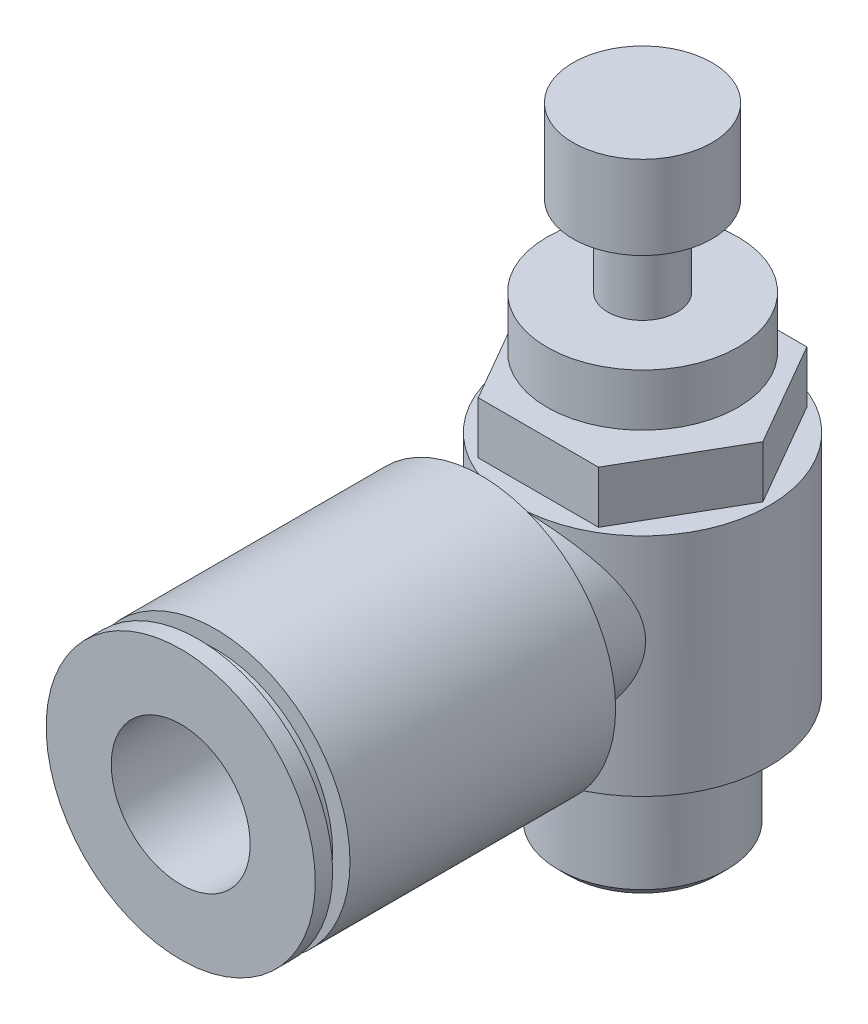
ISO-10303-21;
HEADER;
FILE_DESCRIPTION(('STEP AP214'),'2;1');
FILE_NAME('part.step','',(''),(''),'','','');
FILE_SCHEMA(('AUTOMOTIVE_DESIGN { 1 0 10303 214 1 1 1 1 }'));
ENDSEC;
DATA;
#1=APPLICATION_CONTEXT('core data for automotive mechanical design processes');
#2=APPLICATION_PROTOCOL_DEFINITION('international standard','automotive_design',2000,#1);
#3=PRODUCT_CONTEXT('',#1,'mechanical');
#4=PRODUCT('Part','Part','',(#3));
#5=PRODUCT_RELATED_PRODUCT_CATEGORY('part','',(#4));
#6=PRODUCT_DEFINITION_FORMATION('','',#4);
#7=PRODUCT_DEFINITION_CONTEXT('part definition',#1,'design');
#8=PRODUCT_DEFINITION('design','',#6,#7);
#9=PRODUCT_DEFINITION_SHAPE('','',#8);
#10=(LENGTH_UNIT() NAMED_UNIT(*) SI_UNIT(.MILLI.,.METRE.));
#11=(NAMED_UNIT(*) PLANE_ANGLE_UNIT() SI_UNIT($,.RADIAN.));
#12=(NAMED_UNIT(*) SI_UNIT($,.STERADIAN.) SOLID_ANGLE_UNIT());
#13=UNCERTAINTY_MEASURE_WITH_UNIT(LENGTH_MEASURE(1.E-05),#10,'distance_accuracy_value','');
#14=(GEOMETRIC_REPRESENTATION_CONTEXT(3) GLOBAL_UNCERTAINTY_ASSIGNED_CONTEXT((#13)) GLOBAL_UNIT_ASSIGNED_CONTEXT((#10,
#11,#12)) REPRESENTATION_CONTEXT('',''));
#15=CARTESIAN_POINT('',(0.,0.,0.));
#16=DIRECTION('',(0.,0.,1.));
#17=DIRECTION('',(1.,0.,0.));
#18=AXIS2_PLACEMENT_3D('',#15,#16,#17);
#19=CARTESIAN_POINT('',(4.04800210819405,21.7,4.));
#20=DIRECTION('',(0.,1.,0.));
#21=DIRECTION('',(0.,0.,-1.));
#22=AXIS2_PLACEMENT_3D('',#19,#20,#21);
#23=PLANE('',#22);
#24=CARTESIAN_POINT('',(0.,21.7,0.));
#25=DIRECTION('',(0.,-1.,0.));
#26=DIRECTION('',(0.,0.,-1.));
#27=AXIS2_PLACEMENT_3D('',#24,#25,#26);
#28=CIRCLE('',#27,4.);
#29=CARTESIAN_POINT('',(0.,21.7,-4.));
#30=VERTEX_POINT('',#29);
#31=EDGE_CURVE('E19',#30,#30,#28,.T.);
#32=ORIENTED_EDGE('',*,*,#31,.F.);
#33=EDGE_LOOP('',(#32));
#34=FACE_BOUND('',#33,.T.);
#35=ADVANCED_FACE('F16',(#34),#23,.T.);
#36=CARTESIAN_POINT('',(0.,16.9,0.));
#37=DIRECTION('',(0.,-1.,0.));
#38=DIRECTION('',(0.,0.,-1.));
#39=AXIS2_PLACEMENT_3D('',#36,#37,#38);
#40=CYLINDRICAL_SURFACE('',#39,4.);
#41=CARTESIAN_POINT('',(0.,16.9,0.));
#42=DIRECTION('',(0.,-1.,0.));
#43=DIRECTION('',(0.,0.,-1.));
#44=AXIS2_PLACEMENT_3D('',#41,#42,#43);
#45=CIRCLE('',#44,4.);
#46=CARTESIAN_POINT('',(0.,16.9,-4.));
#47=VERTEX_POINT('',#46);
#48=EDGE_CURVE('E210',#47,#47,#45,.T.);
#49=ORIENTED_EDGE('',*,*,#48,.F.);
#50=EDGE_LOOP('',(#49));
#51=FACE_BOUND('',#50,.T.);
#52=ORIENTED_EDGE('',*,*,#31,.T.);
#53=EDGE_LOOP('',(#52));
#54=FACE_BOUND('',#53,.T.);
#55=ADVANCED_FACE('F116',(#51,#54),#40,.T.);
#56=CARTESIAN_POINT('',(-4.08,-4.,8.1));
#57=CARTESIAN_POINT('',(-4.,-4.,8.1));
#58=CARTESIAN_POINT('',(4.,-4.,8.1));
#59=CARTESIAN_POINT('',(4.0808,-4.,8.1));
#60=B_SPLINE_CURVE_WITH_KNOTS('',1,(#56,#57,#58,#59),.UNSPECIFIED.,.F.,.F.,(2,1,1,2),(-0.01,0.,
1.,1.0101),.UNSPECIFIED.);
#61=DIRECTION('',(0.,1.,0.));
#62=VECTOR('',#61,1.);
#63=SURFACE_OF_LINEAR_EXTRUSION('',#60,#62);
#64=CARTESIAN_POINT('',(0.,0.,8.1));
#65=DIRECTION('',(0.,0.,-1.));
#66=DIRECTION('',(-1.,0.,0.));
#67=AXIS2_PLACEMENT_3D('',#64,#65,#66);
#68=CIRCLE('',#67,4.);
#69=CARTESIAN_POINT('',(-4.00000000000001,0.,8.1));
#70=VERTEX_POINT('',#69);
#71=EDGE_CURVE('E208',#70,#70,#68,.T.);
#72=ORIENTED_EDGE('',*,*,#71,.F.);
#73=EDGE_LOOP('',(#72));
#74=FACE_BOUND('',#73,.T.);
#75=ADVANCED_FACE('F112',(#74),#63,.T.);
#76=CARTESIAN_POINT('',(4.04800210819405,16.9,-4.));
#77=DIRECTION('',(0.,-1.,0.));
#78=DIRECTION('',(0.,0.,1.));
#79=AXIS2_PLACEMENT_3D('',#76,#77,#78);
#80=PLANE('',#79);
#81=CARTESIAN_POINT('',(0.,16.9,0.));
#82=DIRECTION('',(0.,-1.,0.));
#83=DIRECTION('',(1.,0.,0.));
#84=AXIS2_PLACEMENT_3D('',#81,#82,#83);
#85=CIRCLE('',#84,2.);
#86=CARTESIAN_POINT('',(2.,16.9,0.));
#87=VERTEX_POINT('',#86);
#88=EDGE_CURVE('E205',#87,#87,#85,.T.);
#89=ORIENTED_EDGE('',*,*,#88,.F.);
#90=EDGE_LOOP('',(#89));
#91=FACE_BOUND('',#90,.T.);
#92=ORIENTED_EDGE('',*,*,#48,.T.);
#93=EDGE_LOOP('',(#92));
#94=FACE_BOUND('',#93,.T.);
#95=ADVANCED_FACE('F115',(#91,#94),#80,.T.);
#96=CARTESIAN_POINT('',(0.,0.,26.6));
#97=DIRECTION('',(0.,0.,-1.));
#98=DIRECTION('',(-1.,0.,0.));
#99=AXIS2_PLACEMENT_3D('',#96,#97,#98);
#100=CYLINDRICAL_SURFACE('',#99,4.);
#101=CARTESIAN_POINT('',(0.,0.,26.6));
#102=DIRECTION('',(0.,0.,-1.));
#103=DIRECTION('',(-1.,0.,0.));
#104=AXIS2_PLACEMENT_3D('',#101,#102,#103);
#105=CIRCLE('',#104,4.);
#106=CARTESIAN_POINT('',(-4.,0.,26.6));
#107=VERTEX_POINT('',#106);
#108=EDGE_CURVE('E202',#107,#107,#105,.T.);
#109=ORIENTED_EDGE('',*,*,#108,.F.);
#110=EDGE_LOOP('',(#109));
#111=FACE_BOUND('',#110,.T.);
#112=ORIENTED_EDGE('',*,*,#71,.T.);
#113=EDGE_LOOP('',(#112));
#114=FACE_BOUND('',#113,.T.);
#115=ADVANCED_FACE('F216',(#111,#114),#100,.F.);
#116=CARTESIAN_POINT('',(0.,12.25,0.));
#117=DIRECTION('',(0.,-1.,0.));
#118=DIRECTION('',(1.,0.,0.));
#119=AXIS2_PLACEMENT_3D('',#116,#117,#118);
#120=CYLINDRICAL_SURFACE('',#119,2.);
#121=CARTESIAN_POINT('',(0.,12.25,0.));
#122=DIRECTION('',(0.,-1.,0.));
#123=DIRECTION('',(1.,0.,0.));
#124=AXIS2_PLACEMENT_3D('',#121,#122,#123);
#125=CIRCLE('',#124,2.);
#126=CARTESIAN_POINT('',(2.,12.25,0.));
#127=VERTEX_POINT('',#126);
#128=EDGE_CURVE('E199',#127,#127,#125,.T.);
#129=ORIENTED_EDGE('',*,*,#128,.F.);
#130=EDGE_LOOP('',(#129));
#131=FACE_BOUND('',#130,.T.);
#132=ORIENTED_EDGE('',*,*,#88,.T.);
#133=EDGE_LOOP('',(#132));
#134=FACE_BOUND('',#133,.T.);
#135=ADVANCED_FACE('F221',(#131,#134),#120,.T.);
#136=CARTESIAN_POINT('',(7.84300210826893,-7.75,26.6));
#137=DIRECTION('',(0.,0.,1.));
#138=DIRECTION('',(0.,1.,0.));
#139=AXIS2_PLACEMENT_3D('',#136,#137,#138);
#140=PLANE('',#139);
#141=ORIENTED_EDGE('',*,*,#108,.T.);
#142=EDGE_LOOP('',(#141));
#143=FACE_BOUND('',#142,.T.);
#144=CARTESIAN_POINT('',(0.,0.,26.6));
#145=DIRECTION('',(0.,0.,1.));
#146=DIRECTION('',(1.,0.,0.));
#147=AXIS2_PLACEMENT_3D('',#144,#145,#146);
#148=CIRCLE('',#147,7.75);
#149=CARTESIAN_POINT('',(7.75,0.,26.6));
#150=VERTEX_POINT('',#149);
#151=EDGE_CURVE('E196',#150,#150,#148,.F.);
#152=ORIENTED_EDGE('',*,*,#151,.F.);
#153=EDGE_LOOP('',(#152));
#154=FACE_BOUND('',#153,.T.);
#155=ADVANCED_FACE('F226',(#143,#154),#140,.T.);
#156=CARTESIAN_POINT('',(5.56600210823252,12.25,5.5));
#157=DIRECTION('',(0.,1.,0.));
#158=DIRECTION('',(0.,0.,-1.));
#159=AXIS2_PLACEMENT_3D('',#156,#157,#158);
#160=PLANE('',#159);
#161=ORIENTED_EDGE('',*,*,#128,.T.);
#162=EDGE_LOOP('',(#161));
#163=FACE_BOUND('',#162,.T.);
#164=CARTESIAN_POINT('',(0.,12.25,0.));
#165=DIRECTION('',(0.,-1.,0.));
#166=DIRECTION('',(1.,0.,0.));
#167=AXIS2_PLACEMENT_3D('',#164,#165,#166);
#168=CIRCLE('',#167,5.5);
#169=CARTESIAN_POINT('',(5.5,12.25,0.));
#170=VERTEX_POINT('',#169);
#171=EDGE_CURVE('E193',#170,#170,#168,.T.);
#172=ORIENTED_EDGE('',*,*,#171,.F.);
#173=EDGE_LOOP('',(#172));
#174=FACE_BOUND('',#173,.T.);
#175=ADVANCED_FACE('F232',(#163,#174),#160,.T.);
#176=CARTESIAN_POINT('',(0.,0.,26.6));
#177=DIRECTION('',(0.,0.,1.));
#178=DIRECTION('',(1.,0.,0.));
#179=AXIS2_PLACEMENT_3D('',#176,#177,#178);
#180=CYLINDRICAL_SURFACE('',#179,7.75);
#181=ORIENTED_EDGE('',*,*,#151,.T.);
#182=EDGE_LOOP('',(#181));
#183=FACE_BOUND('',#182,.T.);
#184=CARTESIAN_POINT('',(0.,0.,25.6));
#185=DIRECTION('',(0.,0.,1.));
#186=DIRECTION('',(1.,0.,0.));
#187=AXIS2_PLACEMENT_3D('',#184,#185,#186);
#188=CIRCLE('',#187,7.75);
#189=CARTESIAN_POINT('',(7.75,0.,25.6));
#190=VERTEX_POINT('',#189);
#191=EDGE_CURVE('E190',#190,#190,#188,.F.);
#192=ORIENTED_EDGE('',*,*,#191,.F.);
#193=EDGE_LOOP('',(#192));
#194=FACE_BOUND('',#193,.T.);
#195=ADVANCED_FACE('F239',(#183,#194),#180,.T.);
#196=CARTESIAN_POINT('',(0.,9.25,0.));
#197=DIRECTION('',(0.,-1.,0.));
#198=DIRECTION('',(1.,0.,0.));
#199=AXIS2_PLACEMENT_3D('',#196,#197,#198);
#200=CYLINDRICAL_SURFACE('',#199,5.5);
#201=CARTESIAN_POINT('',(0.,9.25,0.));
#202=DIRECTION('',(0.,-1.,0.));
#203=DIRECTION('',(1.,0.,0.));
#204=AXIS2_PLACEMENT_3D('',#201,#202,#203);
#205=CIRCLE('',#204,5.5);
#206=CARTESIAN_POINT('',(5.5,9.25,0.));
#207=VERTEX_POINT('',#206);
#208=EDGE_CURVE('E187',#207,#207,#205,.T.);
#209=ORIENTED_EDGE('',*,*,#208,.F.);
#210=EDGE_LOOP('',(#209));
#211=FACE_BOUND('',#210,.T.);
#212=ORIENTED_EDGE('',*,*,#171,.T.);
#213=EDGE_LOOP('',(#212));
#214=FACE_BOUND('',#213,.T.);
#215=ADVANCED_FACE('F243',(#211,#214),#200,.T.);
#216=CARTESIAN_POINT('',(7.84300210826894,7.75,25.6));
#217=DIRECTION('',(0.,0.,-1.));
#218=DIRECTION('',(0.,-1.,0.));
#219=AXIS2_PLACEMENT_3D('',#216,#217,#218);
#220=PLANE('',#219);
#221=CARTESIAN_POINT('',(0.,0.,25.6));
#222=DIRECTION('',(0.,0.,1.));
#223=DIRECTION('',(1.,0.,0.));
#224=AXIS2_PLACEMENT_3D('',#221,#222,#223);
#225=CIRCLE('',#224,6.75);
#226=CARTESIAN_POINT('',(6.75,0.,25.6));
#227=VERTEX_POINT('',#226);
#228=EDGE_CURVE('E184',#227,#227,#225,.F.);
#229=ORIENTED_EDGE('',*,*,#228,.F.);
#230=EDGE_LOOP('',(#229));
#231=FACE_BOUND('',#230,.T.);
#232=ORIENTED_EDGE('',*,*,#191,.T.);
#233=EDGE_LOOP('',(#232));
#234=FACE_BOUND('',#233,.T.);
#235=ADVANCED_FACE('F247',(#231,#234),#220,.T.);
#236=CARTESIAN_POINT('',(5.56600210823252,9.25,-5.5));
#237=DIRECTION('',(0.,-1.,0.));
#238=DIRECTION('',(0.,0.,1.));
#239=AXIS2_PLACEMENT_3D('',#236,#237,#238);
#240=PLANE('',#239);
#241=CARTESIAN_POINT('',(0.,9.25,0.));
#242=DIRECTION('',(0.,-1.,0.));
#243=DIRECTION('',(0.,0.,-1.));
#244=AXIS2_PLACEMENT_3D('',#241,#242,#243);
#245=CIRCLE('',#244,4.);
#246=CARTESIAN_POINT('',(0.,9.25,-4.));
#247=VERTEX_POINT('',#246);
#248=EDGE_CURVE('E181',#247,#247,#245,.T.);
#249=ORIENTED_EDGE('',*,*,#248,.F.);
#250=EDGE_LOOP('',(#249));
#251=FACE_BOUND('',#250,.T.);
#252=ORIENTED_EDGE('',*,*,#208,.T.);
#253=EDGE_LOOP('',(#252));
#254=FACE_BOUND('',#253,.T.);
#255=ADVANCED_FACE('F251',(#251,#254),#240,.T.);
#256=CARTESIAN_POINT('',(0.,0.,25.6));
#257=DIRECTION('',(0.,0.,1.));
#258=DIRECTION('',(1.,0.,0.));
#259=AXIS2_PLACEMENT_3D('',#256,#257,#258);
#260=CYLINDRICAL_SURFACE('',#259,6.75);
#261=ORIENTED_EDGE('',*,*,#228,.T.);
#262=EDGE_LOOP('',(#261));
#263=FACE_BOUND('',#262,.T.);
#264=CARTESIAN_POINT('',(0.,0.,24.6));
#265=DIRECTION('',(0.,0.,1.));
#266=DIRECTION('',(1.,0.,0.));
#267=AXIS2_PLACEMENT_3D('',#264,#265,#266);
#268=CIRCLE('',#267,6.75);
#269=CARTESIAN_POINT('',(6.75,0.,24.6));
#270=VERTEX_POINT('',#269);
#271=EDGE_CURVE('E178',#270,#270,#268,.F.);
#272=ORIENTED_EDGE('',*,*,#271,.F.);
#273=EDGE_LOOP('',(#272));
#274=FACE_BOUND('',#273,.T.);
#275=ADVANCED_FACE('F255',(#263,#274),#260,.T.);
#276=CARTESIAN_POINT('',(0.,8.25,0.));
#277=DIRECTION('',(0.,-1.,0.));
#278=DIRECTION('',(0.,0.,-1.));
#279=AXIS2_PLACEMENT_3D('',#276,#277,#278);
#280=CYLINDRICAL_SURFACE('',#279,4.);
#281=CARTESIAN_POINT('',(0.,8.25,0.));
#282=DIRECTION('',(0.,-1.,0.));
#283=DIRECTION('',(0.,0.,-1.));
#284=AXIS2_PLACEMENT_3D('',#281,#282,#283);
#285=CIRCLE('',#284,4.);
#286=CARTESIAN_POINT('',(0.,8.25,-4.));
#287=VERTEX_POINT('',#286);
#288=EDGE_CURVE('E175',#287,#287,#285,.T.);
#289=ORIENTED_EDGE('',*,*,#288,.F.);
#290=EDGE_LOOP('',(#289));
#291=FACE_BOUND('',#290,.T.);
#292=ORIENTED_EDGE('',*,*,#248,.T.);
#293=EDGE_LOOP('',(#292));
#294=FACE_BOUND('',#293,.T.);
#295=ADVANCED_FACE('F259',(#291,#294),#280,.T.);
#296=CARTESIAN_POINT('',(7.84300210826893,-7.75,24.6));
#297=DIRECTION('',(0.,0.,1.));
#298=DIRECTION('',(0.,1.,0.));
#299=AXIS2_PLACEMENT_3D('',#296,#297,#298);
#300=PLANE('',#299);
#301=ORIENTED_EDGE('',*,*,#271,.T.);
#302=EDGE_LOOP('',(#301));
#303=FACE_BOUND('',#302,.T.);
#304=CARTESIAN_POINT('',(0.,0.,24.6));
#305=DIRECTION('',(0.,0.,1.));
#306=DIRECTION('',(1.,0.,0.));
#307=AXIS2_PLACEMENT_3D('',#304,#305,#306);
#308=CIRCLE('',#307,7.75);
#309=CARTESIAN_POINT('',(7.75,0.,24.6));
#310=VERTEX_POINT('',#309);
#311=EDGE_CURVE('E93',#310,#310,#308,.F.);
#312=ORIENTED_EDGE('',*,*,#311,.F.);
#313=EDGE_LOOP('',(#312));
#314=FACE_BOUND('',#313,.T.);
#315=ADVANCED_FACE('F263',(#303,#314),#300,.T.);
#316=CARTESIAN_POINT('',(-7.01134166903882,8.25,-6.));
#317=DIRECTION('',(0.,1.,0.));
#318=DIRECTION('',(0.,0.,1.));
#319=AXIS2_PLACEMENT_3D('',#316,#317,#318);
#320=PLANE('',#319);
#321=ORIENTED_EDGE('',*,*,#288,.T.);
#322=EDGE_LOOP('',(#321));
#323=FACE_BOUND('',#322,.T.);
#324=DIRECTION('',(-1.,0.,0.));
#325=VECTOR('',#324,1.);
#326=CARTESIAN_POINT('',(0.,8.25,6.));
#327=LINE('',#326,#325);
#328=CARTESIAN_POINT('',(3.46410161513775,8.25,6.));
#329=VERTEX_POINT('',#328);
#330=CARTESIAN_POINT('',(-3.46410161513775,8.25,6.));
#331=VERTEX_POINT('',#330);
#332=EDGE_CURVE('E81',#329,#331,#327,.T.);
#333=ORIENTED_EDGE('',*,*,#332,.F.);
#334=DIRECTION('',(-0.5,0.,0.866025403784438));
#335=VECTOR('',#334,1.);
#336=CARTESIAN_POINT('',(5.19615242270663,8.25,3.));
#337=LINE('',#336,#335);
#338=CARTESIAN_POINT('',(6.92820310527251,8.25,-2.16511547189088E-07));
#339=VERTEX_POINT('',#338);
#340=EDGE_CURVE('E75',#339,#329,#337,.T.);
#341=ORIENTED_EDGE('',*,*,#340,.F.);
#342=DIRECTION('',(0.5,0.,0.866025403784438));
#343=VECTOR('',#342,1.);
#344=CARTESIAN_POINT('',(5.19615242270663,8.25,-3.));
#345=LINE('',#344,#343);
#346=CARTESIAN_POINT('',(3.46410161513775,8.25,-6.));
#347=VERTEX_POINT('',#346);
#348=EDGE_CURVE('E78',#347,#339,#345,.T.);
#349=ORIENTED_EDGE('',*,*,#348,.F.);
#350=DIRECTION('',(1.,0.,0.));
#351=VECTOR('',#350,1.);
#352=CARTESIAN_POINT('',(0.,8.25,-6.));
#353=LINE('',#352,#351);
#354=CARTESIAN_POINT('',(-3.46410161513775,8.25,-6.));
#355=VERTEX_POINT('',#354);
#356=EDGE_CURVE('E352',#355,#347,#353,.T.);
#357=ORIENTED_EDGE('',*,*,#356,.F.);
#358=DIRECTION('',(0.5,0.,-0.866025403784438));
#359=VECTOR('',#358,1.);
#360=CARTESIAN_POINT('',(-5.19615242270663,8.25,-3.));
#361=LINE('',#360,#359);
#362=CARTESIAN_POINT('',(-6.92820310527251,8.25,-2.16511547405929E-07));
#363=VERTEX_POINT('',#362);
#364=EDGE_CURVE('E357',#363,#355,#361,.T.);
#365=ORIENTED_EDGE('',*,*,#364,.F.);
#366=DIRECTION('',(-0.5,0.,-0.866025403784438));
#367=VECTOR('',#366,1.);
#368=CARTESIAN_POINT('',(-5.19615242270663,8.25,3.));
#369=LINE('',#368,#367);
#370=EDGE_CURVE('E362',#331,#363,#369,.T.);
#371=ORIENTED_EDGE('',*,*,#370,.F.);
#372=EDGE_LOOP('',(#333,#341,#349,#357,#365,#371));
#373=FACE_BOUND('',#372,.T.);
#374=ADVANCED_FACE('F77',(#323,#373),#320,.T.);
#375=CARTESIAN_POINT('',(0.,0.,24.6));
#376=DIRECTION('',(0.,0.,1.));
#377=DIRECTION('',(1.,0.,0.));
#378=AXIS2_PLACEMENT_3D('',#375,#376,#377);
#379=CYLINDRICAL_SURFACE('',#378,7.75);
#380=ORIENTED_EDGE('',*,*,#311,.T.);
#381=EDGE_LOOP('',(#380));
#382=FACE_BOUND('',#381,.T.);
#383=CARTESIAN_POINT('',(0.,0.,9.3));
#384=DIRECTION('',(0.,0.,1.));
#385=DIRECTION('',(1.,0.,0.));
#386=AXIS2_PLACEMENT_3D('',#383,#384,#385);
#387=CIRCLE('',#386,7.75);
#388=CARTESIAN_POINT('',(7.75,0.,9.3));
#389=VERTEX_POINT('',#388);
#390=EDGE_CURVE('E169',#389,#389,#387,.F.);
#391=ORIENTED_EDGE('',*,*,#390,.F.);
#392=EDGE_LOOP('',(#391));
#393=FACE_BOUND('',#392,.T.);
#394=ADVANCED_FACE('F270',(#382,#393),#379,.T.);
#395=CARTESIAN_POINT('',(6.92820323027551,5.25,0.));
#396=DIRECTION('',(0.866025403784438,0.,-0.5));
#397=DIRECTION('',(-0.5,0.,-0.866025403784438));
#398=AXIS2_PLACEMENT_3D('',#395,#396,#397);
#399=PLANE('',#398);
#400=CARTESIAN_POINT('',(3.46410161513776,5.25,-6.));
#401=CARTESIAN_POINT('',(3.60843918243517,5.25,-5.75));
#402=CARTESIAN_POINT('',(3.75277674973257,5.25,-5.5));
#403=CARTESIAN_POINT('',(4.04145188432739,5.25,-5.));
#404=CARTESIAN_POINT('',(4.18578945162479,5.25,-4.75));
#405=CARTESIAN_POINT('',(4.4744645862196,5.25,-4.25));
#406=CARTESIAN_POINT('',(4.61880215351701,5.25,-4.));
#407=CARTESIAN_POINT('',(4.90747728811182,5.25,-3.5));
#408=CARTESIAN_POINT('',(5.05181485540923,5.25,-3.25));
#409=CARTESIAN_POINT('',(5.34048999000404,5.25,-2.75));
#410=CARTESIAN_POINT('',(5.48482755730145,5.25,-2.5));
#411=CARTESIAN_POINT('',(5.77350269189626,5.25,-2.));
#412=CARTESIAN_POINT('',(5.91784025919367,5.25,-1.75));
#413=CARTESIAN_POINT('',(6.20651539378848,5.25,-1.25));
#414=CARTESIAN_POINT('',(6.35085296108588,5.25,-0.999999999999999));
#415=CARTESIAN_POINT('',(6.6395280956807,5.25,-0.5));
#416=CARTESIAN_POINT('',(6.7838656629781,5.25,-0.250000000000001));
#417=CARTESIAN_POINT('',(6.92820323027551,5.25,0.));
#418=B_SPLINE_CURVE_WITH_KNOTS('',3,(#400,#401,#402,#403,#404,#405,#406,#407,#408,#409,#410,
#411,#412,#413,#414,#415,#416,#417),.UNSPECIFIED.,.F.,.F.,(4,2,2,2,2,2,2,2,4),(0.,
0.866025403784437,1.73205080756888,2.59807621135332,3.46410161513775,4.33012701892219,
5.19615242270663,6.06217782649107,6.92820323027551),.UNSPECIFIED.);
#419=CARTESIAN_POINT('',(3.46410161513776,5.25,-6.));
#420=VERTEX_POINT('',#419);
#421=CARTESIAN_POINT('',(6.92820316777329,5.25,-1.08257021402824E-07));
#422=VERTEX_POINT('',#421);
#423=EDGE_CURVE('E172',#420,#422,#418,.T.);
#424=ORIENTED_EDGE('',*,*,#423,.F.);
#425=DIRECTION('',(0.,1.,0.));
#426=VECTOR('',#425,1.);
#427=CARTESIAN_POINT('',(3.46410161513776,5.25,-6.));
#428=LINE('',#427,#426);
#429=EDGE_CURVE('E91',#347,#420,#428,.F.);
#430=ORIENTED_EDGE('',*,*,#429,.F.);
#431=ORIENTED_EDGE('',*,*,#348,.T.);
#432=DIRECTION('',(0.,1.,0.));
#433=VECTOR('',#432,1.);
#434=CARTESIAN_POINT('',(6.92820323027551,5.25,0.));
#435=LINE('',#434,#433);
#436=EDGE_CURVE('E85',#422,#339,#435,.T.);
#437=ORIENTED_EDGE('',*,*,#436,.F.);
#438=EDGE_LOOP('',(#424,#430,#431,#437));
#439=FACE_BOUND('',#438,.T.);
#440=ADVANCED_FACE('F88',(#439),#399,.T.);
#441=CARTESIAN_POINT('',(3.46410161513775,5.25,6.));
#442=DIRECTION('',(0.866025403784438,0.,0.5));
#443=DIRECTION('',(0.5,0.,-0.866025403784438));
#444=AXIS2_PLACEMENT_3D('',#441,#442,#443);
#445=PLANE('',#444);
#446=CARTESIAN_POINT('',(6.92820323027551,5.25,0.));
#447=CARTESIAN_POINT('',(6.7838656629781,5.25,0.25));
#448=CARTESIAN_POINT('',(6.6395280956807,5.25,0.5));
#449=CARTESIAN_POINT('',(6.35085296108588,5.25,1.));
#450=CARTESIAN_POINT('',(6.20651539378848,5.25,1.25));
#451=CARTESIAN_POINT('',(5.91784025919366,5.25,1.75));
#452=CARTESIAN_POINT('',(5.77350269189626,5.25,2.));
#453=CARTESIAN_POINT('',(5.48482755730144,5.25,2.5));
#454=CARTESIAN_POINT('',(5.34048999000404,5.25,2.75));
#455=CARTESIAN_POINT('',(5.05181485540922,5.25,3.25));
#456=CARTESIAN_POINT('',(4.90747728811182,5.25,3.5));
#457=CARTESIAN_POINT('',(4.618802153517,5.25,4.));
#458=CARTESIAN_POINT('',(4.4744645862196,5.25,4.25));
#459=CARTESIAN_POINT('',(4.18578945162478,5.25,4.75));
#460=CARTESIAN_POINT('',(4.04145188432738,5.25,5.));
#461=CARTESIAN_POINT('',(3.75277674973256,5.25,5.5));
#462=CARTESIAN_POINT('',(3.60843918243516,5.25,5.75));
#463=CARTESIAN_POINT('',(3.46410161513775,5.25,6.));
#464=B_SPLINE_CURVE_WITH_KNOTS('',3,(#446,#447,#448,#449,#450,#451,#452,#453,#454,#455,#456,
#457,#458,#459,#460,#461,#462,#463),.UNSPECIFIED.,.F.,.F.,(4,2,2,2,2,2,2,2,4),(0.,
0.866025403784439,1.73205080756888,2.59807621135332,3.46410161513776,4.3301270189222,
5.19615242270663,6.06217782649107,6.92820323027551),.UNSPECIFIED.);
#465=CARTESIAN_POINT('',(3.46410161513775,5.25,6.));
#466=VERTEX_POINT('',#465);
#467=EDGE_CURVE('E97',#422,#466,#464,.T.);
#468=ORIENTED_EDGE('',*,*,#467,.F.);
#469=ORIENTED_EDGE('',*,*,#436,.T.);
#470=ORIENTED_EDGE('',*,*,#340,.T.);
#471=DIRECTION('',(0.,1.,0.));
#472=VECTOR('',#471,1.);
#473=CARTESIAN_POINT('',(3.46410161513775,5.25,6.));
#474=LINE('',#473,#472);
#475=EDGE_CURVE('E100',#466,#329,#474,.T.);
#476=ORIENTED_EDGE('',*,*,#475,.F.);
#477=EDGE_LOOP('',(#468,#469,#470,#476));
#478=FACE_BOUND('',#477,.T.);
#479=ADVANCED_FACE('F95',(#478),#445,.T.);
#480=CARTESIAN_POINT('',(-3.46410161513776,5.25,6.));
#481=DIRECTION('',(0.,0.,1.));
#482=DIRECTION('',(1.,0.,0.));
#483=AXIS2_PLACEMENT_3D('',#480,#481,#482);
#484=PLANE('',#483);
#485=DIRECTION('',(-1.,0.,0.));
#486=VECTOR('',#485,1.);
#487=CARTESIAN_POINT('',(7.3,5.25,6.));
#488=LINE('',#487,#486);
#489=CARTESIAN_POINT('',(-3.46410161513776,5.25,6.));
#490=VERTEX_POINT('',#489);
#491=EDGE_CURVE('E322',#466,#490,#488,.T.);
#492=ORIENTED_EDGE('',*,*,#491,.F.);
#493=ORIENTED_EDGE('',*,*,#475,.T.);
#494=ORIENTED_EDGE('',*,*,#332,.T.);
#495=DIRECTION('',(0.,1.,0.));
#496=VECTOR('',#495,1.);
#497=CARTESIAN_POINT('',(-3.46410161513775,5.25,6.));
#498=LINE('',#497,#496);
#499=EDGE_CURVE('E359',#490,#331,#498,.T.);
#500=ORIENTED_EDGE('',*,*,#499,.F.);
#501=EDGE_LOOP('',(#492,#493,#494,#500));
#502=FACE_BOUND('',#501,.T.);
#503=ADVANCED_FACE('F279',(#502),#484,.T.);
#504=CARTESIAN_POINT('',(-6.92820323027551,5.25,0.));
#505=DIRECTION('',(-0.866025403784438,0.,0.5));
#506=DIRECTION('',(0.5,0.,0.866025403784438));
#507=AXIS2_PLACEMENT_3D('',#504,#505,#506);
#508=PLANE('',#507);
#509=CARTESIAN_POINT('',(-3.46410161513775,5.25,6.));
#510=CARTESIAN_POINT('',(-3.60843918243516,5.25,5.75));
#511=CARTESIAN_POINT('',(-3.75277674973256,5.25,5.5));
#512=CARTESIAN_POINT('',(-4.04145188432738,5.25,5.));
#513=CARTESIAN_POINT('',(-4.18578945162478,5.25,4.75));
#514=CARTESIAN_POINT('',(-4.4744645862196,5.25,4.25));
#515=CARTESIAN_POINT('',(-4.618802153517,5.25,4.));
#516=CARTESIAN_POINT('',(-4.90747728811182,5.25,3.5));
#517=CARTESIAN_POINT('',(-5.05181485540922,5.25,3.25));
#518=CARTESIAN_POINT('',(-5.34048999000404,5.25,2.75));
#519=CARTESIAN_POINT('',(-5.48482755730144,5.25,2.5));
#520=CARTESIAN_POINT('',(-5.77350269189626,5.25,2.));
#521=CARTESIAN_POINT('',(-5.91784025919366,5.25,1.75));
#522=CARTESIAN_POINT('',(-6.20651539378848,5.25,1.25));
#523=CARTESIAN_POINT('',(-6.35085296108588,5.25,1.));
#524=CARTESIAN_POINT('',(-6.63952809568069,5.25,0.499999999999999));
#525=CARTESIAN_POINT('',(-6.7838656629781,5.25,0.249999999999999));
#526=CARTESIAN_POINT('',(-6.92820323027551,5.25,0.));
#527=B_SPLINE_CURVE_WITH_KNOTS('',3,(#509,#510,#511,#512,#513,#514,#515,#516,#517,#518,#519,
#520,#521,#522,#523,#524,#525,#526),.UNSPECIFIED.,.F.,.F.,(4,2,2,2,2,2,2,2,4),(0.,
0.866025403784438,1.73205080756888,2.59807621135332,3.46410161513776,4.33012701892219,
5.19615242270663,6.06217782649107,6.92820323027551),.UNSPECIFIED.);
#528=CARTESIAN_POINT('',(-6.92820316777329,5.25,1.08257021402824E-07));
#529=VERTEX_POINT('',#528);
#530=EDGE_CURVE('E323',#490,#529,#527,.T.);
#531=ORIENTED_EDGE('',*,*,#530,.F.);
#532=ORIENTED_EDGE('',*,*,#499,.T.);
#533=ORIENTED_EDGE('',*,*,#370,.T.);
#534=DIRECTION('',(0.,1.,0.));
#535=VECTOR('',#534,1.);
#536=CARTESIAN_POINT('',(-6.92820323027551,5.25,0.));
#537=LINE('',#536,#535);
#538=EDGE_CURVE('E354',#529,#363,#537,.T.);
#539=ORIENTED_EDGE('',*,*,#538,.F.);
#540=EDGE_LOOP('',(#531,#532,#533,#539));
#541=FACE_BOUND('',#540,.T.);
#542=ADVANCED_FACE('F282',(#541),#508,.T.);
#543=CARTESIAN_POINT('',(-3.46410161513775,5.25,-6.));
#544=DIRECTION('',(-0.866025403784438,0.,-0.5));
#545=DIRECTION('',(-0.5,0.,0.866025403784438));
#546=AXIS2_PLACEMENT_3D('',#543,#544,#545);
#547=PLANE('',#546);
#548=CARTESIAN_POINT('',(-6.92820323027551,5.25,0.));
#549=CARTESIAN_POINT('',(-6.7838656629781,5.25,-0.25));
#550=CARTESIAN_POINT('',(-6.63952809568069,5.25,-0.5));
#551=CARTESIAN_POINT('',(-6.35085296108588,5.25,-0.999999999999999));
#552=CARTESIAN_POINT('',(-6.20651539378848,5.25,-1.25));
#553=CARTESIAN_POINT('',(-5.91784025919366,5.25,-1.75));
#554=CARTESIAN_POINT('',(-5.77350269189626,5.25,-2.));
#555=CARTESIAN_POINT('',(-5.48482755730145,5.25,-2.5));
#556=CARTESIAN_POINT('',(-5.34048999000404,5.25,-2.75));
#557=CARTESIAN_POINT('',(-5.05181485540922,5.25,-3.25));
#558=CARTESIAN_POINT('',(-4.90747728811182,5.25,-3.5));
#559=CARTESIAN_POINT('',(-4.618802153517,5.25,-4.));
#560=CARTESIAN_POINT('',(-4.4744645862196,5.25,-4.25));
#561=CARTESIAN_POINT('',(-4.18578945162479,5.25,-4.75));
#562=CARTESIAN_POINT('',(-4.04145188432738,5.25,-5.));
#563=CARTESIAN_POINT('',(-3.75277674973257,5.25,-5.5));
#564=CARTESIAN_POINT('',(-3.60843918243516,5.25,-5.75));
#565=CARTESIAN_POINT('',(-3.46410161513775,5.25,-6.));
#566=B_SPLINE_CURVE_WITH_KNOTS('',3,(#548,#549,#550,#551,#552,#553,#554,#555,#556,#557,#558,
#559,#560,#561,#562,#563,#564,#565),.UNSPECIFIED.,.F.,.F.,(4,2,2,2,2,2,2,2,4),(0.,
0.86602540378444,1.73205080756888,2.59807621135332,3.46410161513776,4.3301270189222,
5.19615242270663,6.06217782649107,6.92820323027551),.UNSPECIFIED.);
#567=CARTESIAN_POINT('',(-3.46410161513775,5.25,-6.));
#568=VERTEX_POINT('',#567);
#569=EDGE_CURVE('E332',#529,#568,#566,.T.);
#570=ORIENTED_EDGE('',*,*,#569,.F.);
#571=ORIENTED_EDGE('',*,*,#538,.T.);
#572=ORIENTED_EDGE('',*,*,#364,.T.);
#573=DIRECTION('',(0.,1.,0.));
#574=VECTOR('',#573,1.);
#575=CARTESIAN_POINT('',(-3.46410161513775,5.25,-6.));
#576=LINE('',#575,#574);
#577=EDGE_CURVE('E40',#568,#355,#576,.T.);
#578=ORIENTED_EDGE('',*,*,#577,.F.);
#579=EDGE_LOOP('',(#570,#571,#572,#578));
#580=FACE_BOUND('',#579,.T.);
#581=ADVANCED_FACE('F286',(#580),#547,.T.);
#582=CARTESIAN_POINT('',(3.46410161513776,5.25,-6.));
#583=DIRECTION('',(0.,0.,-1.));
#584=DIRECTION('',(-1.,0.,0.));
#585=AXIS2_PLACEMENT_3D('',#582,#583,#584);
#586=PLANE('',#585);
#587=DIRECTION('',(-1.,0.,0.));
#588=VECTOR('',#587,1.);
#589=CARTESIAN_POINT('',(7.3,5.25,-6.));
#590=LINE('',#589,#588);
#591=EDGE_CURVE('E168',#568,#420,#590,.F.);
#592=ORIENTED_EDGE('',*,*,#591,.F.);
#593=ORIENTED_EDGE('',*,*,#577,.T.);
#594=ORIENTED_EDGE('',*,*,#356,.T.);
#595=ORIENTED_EDGE('',*,*,#429,.T.);
#596=EDGE_LOOP('',(#592,#593,#594,#595));
#597=FACE_BOUND('',#596,.T.);
#598=ADVANCED_FACE('F290',(#597),#586,.T.);
#599=CARTESIAN_POINT('',(7.84300210826894,7.75,9.3));
#600=DIRECTION('',(0.,0.,-1.));
#601=DIRECTION('',(0.,-1.,0.));
#602=AXIS2_PLACEMENT_3D('',#599,#600,#601);
#603=PLANE('',#602);
#604=CARTESIAN_POINT('',(0.,0.,9.3));
#605=DIRECTION('',(0.,0.,1.));
#606=DIRECTION('',(1.,0.,0.));
#607=AXIS2_PLACEMENT_3D('',#604,#605,#606);
#608=CIRCLE('',#607,5.25);
#609=CARTESIAN_POINT('',(5.25,0.,9.3));
#610=VERTEX_POINT('',#609);
#611=EDGE_CURVE('E165',#610,#610,#608,.F.);
#612=ORIENTED_EDGE('',*,*,#611,.F.);
#613=EDGE_LOOP('',(#612));
#614=FACE_BOUND('',#613,.T.);
#615=ORIENTED_EDGE('',*,*,#390,.T.);
#616=EDGE_LOOP('',(#615));
#617=FACE_BOUND('',#616,.T.);
#618=ADVANCED_FACE('F293',(#614,#617),#603,.T.);
#619=CARTESIAN_POINT('',(7.38760210826612,5.25,7.3));
#620=DIRECTION('',(0.,1.,0.));
#621=DIRECTION('',(0.,0.,-1.));
#622=AXIS2_PLACEMENT_3D('',#619,#620,#621);
#623=PLANE('',#622);
#624=ORIENTED_EDGE('',*,*,#569,.T.);
#625=ORIENTED_EDGE('',*,*,#591,.T.);
#626=ORIENTED_EDGE('',*,*,#423,.T.);
#627=ORIENTED_EDGE('',*,*,#467,.T.);
#628=ORIENTED_EDGE('',*,*,#491,.T.);
#629=ORIENTED_EDGE('',*,*,#530,.T.);
#630=EDGE_LOOP('',(#624,#625,#626,#627,#628,#629));
#631=FACE_BOUND('',#630,.T.);
#632=CARTESIAN_POINT('',(0.,5.25,0.));
#633=DIRECTION('',(0.,-1.,0.));
#634=DIRECTION('',(0.,0.,-1.));
#635=AXIS2_PLACEMENT_3D('',#632,#633,#634);
#636=CIRCLE('',#635,7.3);
#637=CARTESIAN_POINT('',(0.,5.25,7.3));
#638=VERTEX_POINT('',#637);
#639=EDGE_CURVE('E163',#638,#638,#636,.T.);
#640=ORIENTED_EDGE('',*,*,#639,.F.);
#641=EDGE_LOOP('',(#640));
#642=FACE_BOUND('',#641,.T.);
#643=ADVANCED_FACE('F297',(#631,#642),#623,.T.);
#644=CARTESIAN_POINT('',(0.,0.,9.3));
#645=DIRECTION('',(0.,0.,1.));
#646=DIRECTION('',(1.,0.,0.));
#647=AXIS2_PLACEMENT_3D('',#644,#645,#646);
#648=CYLINDRICAL_SURFACE('',#647,5.25);
#649=ORIENTED_EDGE('',*,*,#611,.T.);
#650=EDGE_LOOP('',(#649));
#651=FACE_BOUND('',#650,.T.);
#652=CARTESIAN_POINT('',(0.,5.25,7.3));
#653=CARTESIAN_POINT('',(0.129550621350862,5.24999902547532,7.29999906460579));
#654=CARTESIAN_POINT('',(0.259119848122385,5.2451968979198,7.29654336509262));
#655=CARTESIAN_POINT('',(0.517240949472566,5.22606204847841,7.28280037609426));
#656=CARTESIAN_POINT('',(0.645792266927527,5.21172442935931,7.27250957624506));
#657=CARTESIAN_POINT('',(0.901012942516516,5.1737170011698,7.2453206243386));
#658=CARTESIAN_POINT('',(1.02767886855809,5.15003192616239,7.22841166410863));
#659=CARTESIAN_POINT('',(1.27804093415714,5.09368108223173,7.18837217276169));
#660=CARTESIAN_POINT('',(1.40173574521633,5.06101137432822,7.16523891292707));
#661=CARTESIAN_POINT('',(1.64455285335095,4.98737787171699,7.1134209130566));
#662=CARTESIAN_POINT('',(1.76369889441963,4.94646718433818,7.08477176880145));
#663=CARTESIAN_POINT('',(1.99761849672852,4.85672063891104,7.0224069534788));
#664=CARTESIAN_POINT('',(2.11239031599181,4.80788166341663,6.98868928982938));
#665=CARTESIAN_POINT('',(2.44917535212084,4.65030872721406,6.88091262606352));
#666=CARTESIAN_POINT('',(2.66395571743225,4.53042690771171,6.80016408082259));
#667=CARTESIAN_POINT('',(3.0895131867346,4.2529723255449,6.61840574883454));
#668=CARTESIAN_POINT('',(3.29818081698012,4.09297485824256,6.51622524928062));
#669=CARTESIAN_POINT('',(3.68768171658566,3.74588506061446,6.30398241501702));
#670=CARTESIAN_POINT('',(3.86847078612107,3.55875059923507,6.19390796153032));
#671=CARTESIAN_POINT('',(4.13293663862219,3.24114622036226,6.0185428986292));
#672=CARTESIAN_POINT('',(4.2262256466178,3.11854539342981,5.95322757446136));
#673=CARTESIAN_POINT('',(4.40211104804817,2.86491563565593,5.82437005319317));
#674=CARTESIAN_POINT('',(4.4847044787487,2.73388438452173,5.76082835120342));
#675=CARTESIAN_POINT('',(4.63855724688885,2.46381660414011,5.63768451193502));
#676=CARTESIAN_POINT('',(4.70983221702197,2.32479148394947,5.57807700859368));
#677=CARTESIAN_POINT('',(4.84047585403534,2.03887850112625,5.4650935393303));
#678=CARTESIAN_POINT('',(4.89984642810417,1.89199190275624,5.41171657579467));
#679=CARTESIAN_POINT('',(5.02435736155294,1.53776554927667,5.29673043499859));
#680=CARTESIAN_POINT('',(5.08424237574246,1.32726301710426,5.23878018695136));
#681=CARTESIAN_POINT('',(5.15432944478983,1.00378344081875,5.16952174810936));
#682=CARTESIAN_POINT('',(5.17439641691486,0.894727953841008,5.14938597288402));
#683=CARTESIAN_POINT('',(5.20766919312788,0.674575613136318,5.11573524791335));
#684=CARTESIAN_POINT('',(5.22087773906135,0.563479593588094,5.10221765249127));
#685=CARTESIAN_POINT('',(5.2402461406001,0.33923179091478,5.0823239283958));
#686=CARTESIAN_POINT('',(5.24635516639926,0.226071004433324,5.0759993054083));
#687=CARTESIAN_POINT('',(5.25122325978402,-0.000577797718331175,5.07096315637886));
#688=CARTESIAN_POINT('',(5.24998256901173,-0.114065802507713,5.07225138004367));
#689=CARTESIAN_POINT('',(5.24017599473671,-0.340437565249052,5.08238171554773));
#690=CARTESIAN_POINT('',(5.2316064931086,-0.453320997029144,5.09122755846955));
#691=CARTESIAN_POINT('',(5.20731618815556,-0.67756063406347,5.11606852179657));
#692=CARTESIAN_POINT('',(5.19159180898979,-0.788916046948013,5.13206721696068));
#693=CARTESIAN_POINT('',(5.1509303012587,-1.02283001646585,5.17289502782847));
#694=CARTESIAN_POINT('',(5.12509933198958,-1.14508619434785,5.19856692817812));
#695=CARTESIAN_POINT('',(5.06528877340727,-1.38591959266082,5.25686181836957));
#696=CARTESIAN_POINT('',(5.03130370310172,-1.50449427767262,5.28948948205823));
#697=CARTESIAN_POINT('',(4.91776596878957,-1.85423193217647,5.3959518150787));
#698=CARTESIAN_POINT('',(4.82667284947006,-2.07917484390121,5.47832068131733));
#699=CARTESIAN_POINT('',(4.65292953793719,-2.43676229649143,5.62569973684905));
#700=CARTESIAN_POINT('',(4.57791450677223,-2.57481275986681,5.6871078105096));
#701=CARTESIAN_POINT('',(4.41659244652402,-2.84264463755134,5.81327673368414));
#702=CARTESIAN_POINT('',(4.33028210067713,-2.97242360630323,5.87803856460899));
#703=CARTESIAN_POINT('',(4.14678659167348,-3.22348685294323,6.00889991452106));
#704=CARTESIAN_POINT('',(4.04959267799047,-3.34476416615758,6.07500047437914));
#705=CARTESIAN_POINT('',(3.8447094199187,-3.57838500086911,6.20669299145576));
#706=CARTESIAN_POINT('',(3.7370212013028,-3.6907294782903,6.27228500241552));
#707=CARTESIAN_POINT('',(3.51019573948585,-3.90715505612679,6.40201373914638));
#708=CARTESIAN_POINT('',(3.39094787849941,-4.01113435939351,6.46612724517661));
#709=CARTESIAN_POINT('',(3.1422878310698,-4.20877021196099,6.59055040128227));
#710=CARTESIAN_POINT('',(3.01287453344419,-4.30242563006265,6.65085963421036));
#711=CARTESIAN_POINT('',(2.74454424444036,-4.47835617349701,6.76600024691518));
#712=CARTESIAN_POINT('',(2.605642350946,-4.56064877624108,6.82084000251061));
#713=CARTESIAN_POINT('',(2.31884691822281,-4.71293766359939,6.92359179576655));
#714=CARTESIAN_POINT('',(2.17095709718265,-4.78293898696979,6.97150667081975));
#715=CARTESIAN_POINT('',(1.90600596213073,-4.89332753559847,7.04776555181852));
#716=CARTESIAN_POINT('',(1.79072231029626,-4.9367114506088,7.07798201307432));
#717=CARTESIAN_POINT('',(1.55627055609614,-5.01555657011161,7.13319804901173));
#718=CARTESIAN_POINT('',(1.4371033209938,-5.05101952976876,7.15819877933977));
#719=CARTESIAN_POINT('',(1.19581109639206,-5.11351497692977,7.20243357911112));
#720=CARTESIAN_POINT('',(1.07369308327069,-5.14056558419333,7.22168003944192));
#721=CARTESIAN_POINT('',(0.827092504516728,-5.18595436002114,7.25405877276754));
#722=CARTESIAN_POINT('',(0.702611045083011,-5.20429650485068,7.26719383615816));
#723=CARTESIAN_POINT('',(0.481751927516507,-5.22873596299686,7.28471875460584));
#724=CARTESIAN_POINT('',(0.385681225775782,-5.23670221237416,7.29044143335835));
#725=CARTESIAN_POINT('',(0.193077185139861,-5.24733511598439,7.29808277927422));
#726=CARTESIAN_POINT('',(0.0965437588614088,-5.25000072623564,7.30000069707481));
#727=CARTESIAN_POINT('',(-0.129550621350856,-5.24999902547534,7.29999906460581));
#728=CARTESIAN_POINT('',(-0.259119848122377,-5.2451968979198,7.29654336509262));
#729=CARTESIAN_POINT('',(-0.517240949472558,-5.22606204847841,7.28280037609426));
#730=CARTESIAN_POINT('',(-0.64579226692752,-5.21172442935931,7.27250957624506));
#731=CARTESIAN_POINT('',(-0.90101294251651,-5.1737170011698,7.2453206243386));
#732=CARTESIAN_POINT('',(-1.02767886855809,-5.15003192616239,7.22841166410863));
#733=CARTESIAN_POINT('',(-1.27804093415714,-5.09368108223173,7.18837217276169));
#734=CARTESIAN_POINT('',(-1.40173574521633,-5.06101137432822,7.16523891292707));
#735=CARTESIAN_POINT('',(-1.64455285335095,-4.98737787171699,7.1134209130566));
#736=CARTESIAN_POINT('',(-1.76369889441963,-4.94646718433818,7.08477176880145));
#737=CARTESIAN_POINT('',(-1.99761849672852,-4.85672063891104,7.0224069534788));
#738=CARTESIAN_POINT('',(-2.11239031599181,-4.80788166341663,6.98868928982938));
#739=CARTESIAN_POINT('',(-2.44917535212084,-4.65030872721406,6.88091262606351));
#740=CARTESIAN_POINT('',(-2.66395571743225,-4.53042690771171,6.80016408082259));
#741=CARTESIAN_POINT('',(-3.0895131867346,-4.2529723255449,6.61840574883454));
#742=CARTESIAN_POINT('',(-3.29818081698011,-4.09297485824256,6.51622524928062));
#743=CARTESIAN_POINT('',(-3.68768171658566,-3.74588506061446,6.30398241501703));
#744=CARTESIAN_POINT('',(-3.86847078612107,-3.55875059923507,6.19390796153032));
#745=CARTESIAN_POINT('',(-4.13293663862219,-3.24114622036226,6.0185428986292));
#746=CARTESIAN_POINT('',(-4.2262256466178,-3.11854539342981,5.95322757446136));
#747=CARTESIAN_POINT('',(-4.40211104804817,-2.86491563565592,5.82437005319317));
#748=CARTESIAN_POINT('',(-4.4847044787487,-2.73388438452173,5.76082835120342));
#749=CARTESIAN_POINT('',(-4.63855724688885,-2.46381660414011,5.63768451193502));
#750=CARTESIAN_POINT('',(-4.70983221702197,-2.32479148394947,5.57807700859367));
#751=CARTESIAN_POINT('',(-4.84047585403534,-2.03887850112625,5.4650935393303));
#752=CARTESIAN_POINT('',(-4.89984642810417,-1.89199190275624,5.41171657579467));
#753=CARTESIAN_POINT('',(-5.02435736155294,-1.53776554927667,5.29673043499859));
#754=CARTESIAN_POINT('',(-5.08424237574246,-1.32726301710427,5.23878018695135));
#755=CARTESIAN_POINT('',(-5.15432944478983,-1.00378344081875,5.16952174810936));
#756=CARTESIAN_POINT('',(-5.17439641691486,-0.894727953841012,5.14938597288402));
#757=CARTESIAN_POINT('',(-5.20766919312788,-0.67457561313632,5.11573524791335));
#758=CARTESIAN_POINT('',(-5.22087773906135,-0.563479593588095,5.10221765249127));
#759=CARTESIAN_POINT('',(-5.2402461406001,-0.339231790914781,5.0823239283958));
#760=CARTESIAN_POINT('',(-5.24635516639926,-0.226071004433325,5.0759993054083));
#761=CARTESIAN_POINT('',(-5.25122325978402,0.000577797718330782,5.07096315637886));
#762=CARTESIAN_POINT('',(-5.24998256901173,0.114065802507712,5.07225138004367));
#763=CARTESIAN_POINT('',(-5.24017599473671,0.340437565249051,5.08238171554773));
#764=CARTESIAN_POINT('',(-5.2316064931086,0.453320997029143,5.09122755846954));
#765=CARTESIAN_POINT('',(-5.20731618815556,0.677560634063469,5.11606852179657));
#766=CARTESIAN_POINT('',(-5.19159180898979,0.788916046948013,5.13206721696068));
#767=CARTESIAN_POINT('',(-5.1509303012587,1.02283001646585,5.17289502782847));
#768=CARTESIAN_POINT('',(-5.12509933198958,1.14508619434786,5.19856692817812));
#769=CARTESIAN_POINT('',(-5.06528877340727,1.38591959266082,5.25686181836957));
#770=CARTESIAN_POINT('',(-5.03130370310172,1.50449427767262,5.28948948205823));
#771=CARTESIAN_POINT('',(-4.91776596878957,1.85423193217647,5.39595181507871));
#772=CARTESIAN_POINT('',(-4.82667284947006,2.07917484390121,5.47832068131733));
#773=CARTESIAN_POINT('',(-4.65292953793719,2.43676229649143,5.62569973684905));
#774=CARTESIAN_POINT('',(-4.57791450677223,2.57481275986681,5.6871078105096));
#775=CARTESIAN_POINT('',(-4.41659244652402,2.84264463755134,5.81327673368414));
#776=CARTESIAN_POINT('',(-4.33028210067713,2.97242360630323,5.87803856460899));
#777=CARTESIAN_POINT('',(-4.14678659167348,3.22348685294323,6.00889991452106));
#778=CARTESIAN_POINT('',(-4.04959267799046,3.34476416615758,6.07500047437914));
#779=CARTESIAN_POINT('',(-3.84470941991869,3.57838500086911,6.20669299145576));
#780=CARTESIAN_POINT('',(-3.7370212013028,3.6907294782903,6.27228500241552));
#781=CARTESIAN_POINT('',(-3.51019573948585,3.90715505612679,6.40201373914638));
#782=CARTESIAN_POINT('',(-3.39094787849941,4.01113435939351,6.46612724517661));
#783=CARTESIAN_POINT('',(-3.1422878310698,4.20877021196099,6.59055040128227));
#784=CARTESIAN_POINT('',(-3.01287453344419,4.30242563006265,6.65085963421036));
#785=CARTESIAN_POINT('',(-2.74454424444036,4.47835617349701,6.76600024691518));
#786=CARTESIAN_POINT('',(-2.605642350946,4.56064877624108,6.82084000251061));
#787=CARTESIAN_POINT('',(-2.31884691822281,4.71293766359939,6.92359179576655));
#788=CARTESIAN_POINT('',(-2.17095709718265,4.78293898696979,6.97150667081975));
#789=CARTESIAN_POINT('',(-1.90600596213073,4.89332753559847,7.04776555181852));
#790=CARTESIAN_POINT('',(-1.79072231029626,4.9367114506088,7.07798201307432));
#791=CARTESIAN_POINT('',(-1.55627055609613,5.01555657011161,7.13319804901173));
#792=CARTESIAN_POINT('',(-1.4371033209938,5.05101952976876,7.15819877933977));
#793=CARTESIAN_POINT('',(-1.19581109639207,5.11351497692977,7.20243357911112));
#794=CARTESIAN_POINT('',(-1.07369308327069,5.14056558419333,7.22168003944192));
#795=CARTESIAN_POINT('',(-0.827092504516729,5.18595436002114,7.25405877276754));
#796=CARTESIAN_POINT('',(-0.702611045083011,5.20429650485068,7.26719383615816));
#797=CARTESIAN_POINT('',(-0.481751927516508,5.22873596299686,7.28471875460584));
#798=CARTESIAN_POINT('',(-0.385681225775785,5.23670221237417,7.29044143335835));
#799=CARTESIAN_POINT('',(-0.193077185139862,5.24733511598439,7.29808277927422));
#800=CARTESIAN_POINT('',(-0.0965437588614078,5.25000072623562,7.3000006970748));
#801=CARTESIAN_POINT('',(0.,5.25,7.3));
#802=B_SPLINE_CURVE_WITH_KNOTS('',3,(#652,#653,#654,#655,#656,#657,#658,#659,#660,#661,#662,
#663,#664,#665,#666,#667,#668,#669,#670,#671,#672,#673,#674,#675,#676,#677,#678,#679,#680,#681,
#682,#683,#684,#685,#686,#687,#688,#689,#690,#691,#692,#693,#694,#695,#696,#697,#698,#699,#700,
#701,#702,#703,#704,#705,#706,#707,#708,#709,#710,#711,#712,#713,#714,#715,#716,#717,#718,#719,
#720,#721,#722,#723,#724,#725,#726,#727,#728,#729,#730,#731,#732,#733,#734,#735,#736,#737,#738,
#739,#740,#741,#742,#743,#744,#745,#746,#747,#748,#749,#750,#751,#752,#753,#754,#755,#756,#757,
#758,#759,#760,#761,#762,#763,#764,#765,#766,#767,#768,#769,#770,#771,#772,#773,#774,#775,#776,
#777,#778,#779,#780,#781,#782,#783,#784,#785,#786,#787,#788,#789,#790,#791,#792,#793,#794,#795,
#796,#797,#798,#799,#800,#801),.UNSPECIFIED.,.T.,.F.,(4,2,2,2,2,2,2,2,2,2,2,2,2,2,2,2,2,2,2,2,2,
2,2,2,2,2,2,2,2,2,2,2,2,2,2,2,2,2,2,2,2,2,2,2,2,2,2,2,2,2,2,2,2,2,2,2,2,2,2,2,2,2,2,2,2,2,2,2,2,
2,2,2,2,2,4),(0.,0.388550325340145,0.777300356429223,1.1666879253413,1.55624647973469,
1.94337060087628,2.33064731168366,3.104256300005,3.94766142840664,4.79239027458281,
5.29390759804603,5.79556354876591,6.2965204862856,6.7973971018745,7.47360676747755,
7.81136078883397,8.14897967952062,8.48900118186936,8.8290115051394,9.16918978343239,
9.50953826194547,9.89165839815242,10.2740361095554,11.0395075372255,11.5450710460184,
12.0507833433158,12.5569051993819,13.0629728210467,13.5744798657585,14.0860429012486,
14.5968101094274,15.1073674394666,15.487476672963,15.8675015962232,16.2467022039509,
16.6257295025832,16.9152280982133,17.2047837060831,17.5933340314232,17.9820840625123,
18.3714716314244,18.7610301858178,19.1481543069594,19.5354310177667,20.3090400060881,
21.1524451344897,21.9971739806659,22.4986913041291,23.000347254849,23.5013041923687,
24.0021808079576,24.6783904735606,25.0161444949171,25.3537633856037,25.6937848879524,
26.0337952112225,26.3739734895155,26.7143219680285,27.0964421042355,27.4788198156385,
28.2442912433086,28.7498547521015,29.2555670493989,29.761688905465,30.2677565271298,
30.7792635718416,31.2908266073317,31.8015938155104,32.3121511455497,32.6922603790461,
33.0722853023063,33.451485910034,33.8305132086662,34.1200118042963,34.4095674121661),.UNSPECIFIED.);
#803=EDGE_CURVE('E31',#638,#638,#802,.T.);
#804=ORIENTED_EDGE('',*,*,#803,.F.);
#805=EDGE_LOOP('',(#804));
#806=FACE_BOUND('',#805,.T.);
#807=ADVANCED_FACE('F152',(#651,#806),#648,.T.);
#808=CARTESIAN_POINT('',(0.,-7.75,0.));
#809=DIRECTION('',(0.,-1.,0.));
#810=DIRECTION('',(0.,0.,-1.));
#811=AXIS2_PLACEMENT_3D('',#808,#809,#810);
#812=CYLINDRICAL_SURFACE('',#811,7.3);
#813=CARTESIAN_POINT('',(0.,-7.75,0.));
#814=DIRECTION('',(0.,-1.,0.));
#815=DIRECTION('',(0.,0.,-1.));
#816=AXIS2_PLACEMENT_3D('',#813,#814,#815);
#817=CIRCLE('',#816,7.3);
#818=CARTESIAN_POINT('',(0.,-7.75,-7.3));
#819=VERTEX_POINT('',#818);
#820=EDGE_CURVE('E162',#819,#819,#817,.T.);
#821=ORIENTED_EDGE('',*,*,#820,.F.);
#822=EDGE_LOOP('',(#821));
#823=FACE_BOUND('',#822,.T.);
#824=ORIENTED_EDGE('',*,*,#639,.T.);
#825=ORIENTED_EDGE('',*,*,#803,.T.);
#826=EDGE_LOOP('',(#824,#825));
#827=FACE_BOUND('',#826,.T.);
#828=ADVANCED_FACE('F147',(#823,#827),#812,.T.);
#829=CARTESIAN_POINT('',(7.38760210826612,-7.75,-7.3));
#830=DIRECTION('',(0.,-1.,0.));
#831=DIRECTION('',(0.,0.,1.));
#832=AXIS2_PLACEMENT_3D('',#829,#830,#831);
#833=PLANE('',#832);
#834=CARTESIAN_POINT('',(0.,-7.75,0.));
#835=DIRECTION('',(0.,-1.,0.));
#836=DIRECTION('',(0.,0.,-1.));
#837=AXIS2_PLACEMENT_3D('',#834,#835,#836);
#838=CIRCLE('',#837,4.865);
#839=CARTESIAN_POINT('',(0.,-7.75,-4.865));
#840=VERTEX_POINT('',#839);
#841=EDGE_CURVE('E560',#840,#840,#838,.T.);
#842=ORIENTED_EDGE('',*,*,#841,.F.);
#843=EDGE_LOOP('',(#842));
#844=FACE_BOUND('',#843,.T.);
#845=ORIENTED_EDGE('',*,*,#820,.T.);
#846=EDGE_LOOP('',(#845));
#847=FACE_BOUND('',#846,.T.);
#848=ADVANCED_FACE('F143',(#844,#847),#833,.T.);
#849=CARTESIAN_POINT('',(0.,-14.12,0.));
#850=DIRECTION('',(0.,-1.,0.));
#851=DIRECTION('',(0.,0.,-1.));
#852=AXIS2_PLACEMENT_3D('',#849,#850,#851);
#853=CYLINDRICAL_SURFACE('',#852,4.865);
#854=ORIENTED_EDGE('',*,*,#841,.T.);
#855=EDGE_LOOP('',(#854));
#856=FACE_BOUND('',#855,.T.);
#857=CARTESIAN_POINT('',(0.,-14.12,0.));
#858=DIRECTION('',(0.,-1.,0.));
#859=DIRECTION('',(0.,0.,1.));
#860=AXIS2_PLACEMENT_3D('',#857,#858,#859);
#861=CIRCLE('',#860,4.865);
#862=CARTESIAN_POINT('',(0.,-14.12,4.865));
#863=VERTEX_POINT('',#862);
#864=EDGE_CURVE('E24',#863,#863,#861,.T.);
#865=ORIENTED_EDGE('',*,*,#864,.F.);
#866=EDGE_LOOP('',(#865));
#867=FACE_BOUND('',#866,.T.);
#868=ADVANCED_FACE('F136',(#856,#867),#853,.T.);
#869=CARTESIAN_POINT('',(4.33642210820387,-14.7,-4.285));
#870=DIRECTION('',(0.,-1.,0.));
#871=DIRECTION('',(0.,0.,1.));
#872=AXIS2_PLACEMENT_3D('',#869,#870,#871);
#873=PLANE('',#872);
#874=CARTESIAN_POINT('',(0.,-14.7,0.));
#875=DIRECTION('',(0.,1.,0.));
#876=DIRECTION('',(0.,0.,1.));
#877=AXIS2_PLACEMENT_3D('',#874,#875,#876);
#878=CIRCLE('',#877,4.285);
#879=CARTESIAN_POINT('',(0.,-14.7,4.285));
#880=VERTEX_POINT('',#879);
#881=EDGE_CURVE('E11',#880,#880,#878,.T.);
#882=ORIENTED_EDGE('',*,*,#881,.F.);
#883=EDGE_LOOP('',(#882));
#884=FACE_BOUND('',#883,.T.);
#885=ADVANCED_FACE('F130',(#884),#873,.T.);
#886=CARTESIAN_POINT('',(0.,-14.7,0.));
#887=DIRECTION('',(0.,1.,0.));
#888=DIRECTION('',(0.,0.,1.));
#889=AXIS2_PLACEMENT_3D('',#886,#887,#888);
#890=CONICAL_SURFACE('',#889,4.285,0.785398163397447);
#891=ORIENTED_EDGE('',*,*,#881,.T.);
#892=EDGE_LOOP('',(#891));
#893=FACE_BOUND('',#892,.T.);
#894=ORIENTED_EDGE('',*,*,#864,.T.);
#895=EDGE_LOOP('',(#894));
#896=FACE_BOUND('',#895,.T.);
#897=ADVANCED_FACE('F128',(#893,#896),#890,.T.);
#898=CLOSED_SHELL('',(#35,#55,#75,#95,#115,#135,#155,#175,#195,#215,#235,#255,#275,#295,#315,
#374,#394,#440,#479,#503,#542,#581,#598,#618,#643,#807,#828,#848,#868,#885,#897));
#899=MANIFOLD_SOLID_BREP('B1',#898);
#900=ADVANCED_BREP_SHAPE_REPRESENTATION('',(#18,#899),#14);
#901=SHAPE_DEFINITION_REPRESENTATION(#9,#900);
ENDSEC;
END-ISO-10303-21;
